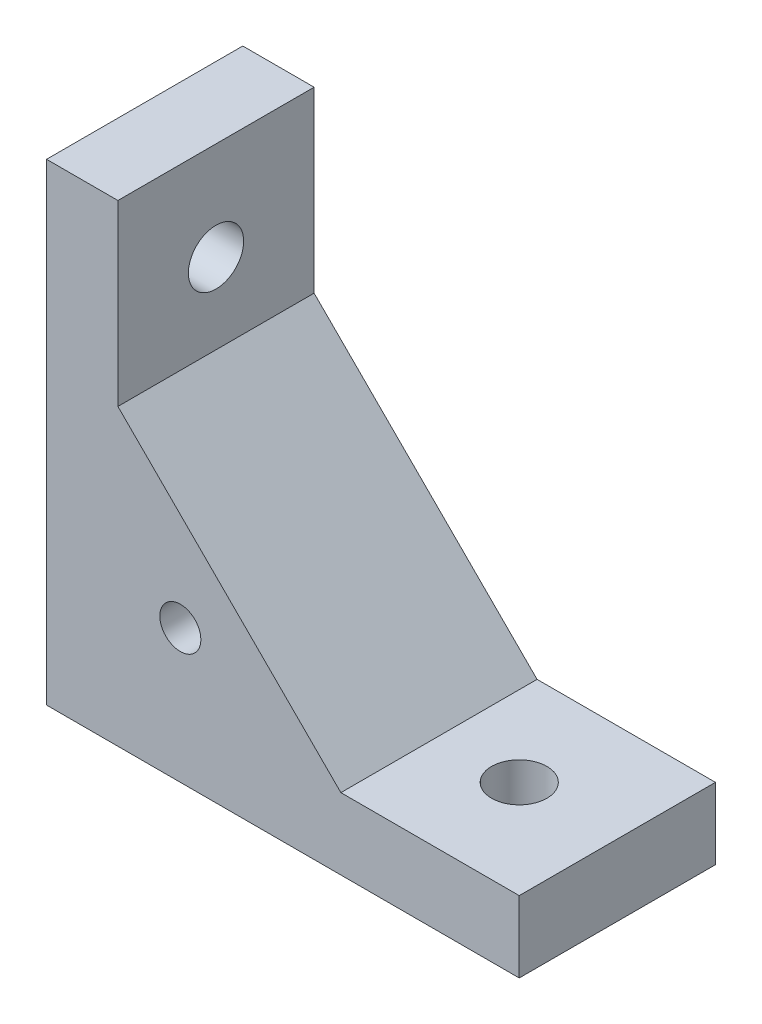
ISO-10303-21;
HEADER;
FILE_DESCRIPTION(('STEP AP214'),'2;1');
FILE_NAME('part.step','',(''),(''),'','','');
FILE_SCHEMA(('AUTOMOTIVE_DESIGN { 1 0 10303 214 1 1 1 1 }'));
ENDSEC;
DATA;
#1=APPLICATION_CONTEXT('core data for automotive mechanical design processes');
#2=APPLICATION_PROTOCOL_DEFINITION('international standard','automotive_design',2000,#1);
#3=PRODUCT_CONTEXT('',#1,'mechanical');
#4=PRODUCT('Part','Part','',(#3));
#5=PRODUCT_RELATED_PRODUCT_CATEGORY('part','',(#4));
#6=PRODUCT_DEFINITION_FORMATION('','',#4);
#7=PRODUCT_DEFINITION_CONTEXT('part definition',#1,'design');
#8=PRODUCT_DEFINITION('design','',#6,#7);
#9=PRODUCT_DEFINITION_SHAPE('','',#8);
#10=(LENGTH_UNIT() NAMED_UNIT(*) SI_UNIT(.MILLI.,.METRE.));
#11=(NAMED_UNIT(*) PLANE_ANGLE_UNIT() SI_UNIT($,.RADIAN.));
#12=(NAMED_UNIT(*) SI_UNIT($,.STERADIAN.) SOLID_ANGLE_UNIT());
#13=UNCERTAINTY_MEASURE_WITH_UNIT(LENGTH_MEASURE(1.E-05),#10,'distance_accuracy_value','');
#14=(GEOMETRIC_REPRESENTATION_CONTEXT(3) GLOBAL_UNCERTAINTY_ASSIGNED_CONTEXT((#13)) GLOBAL_UNIT_ASSIGNED_CONTEXT((#10,
#11,#12)) REPRESENTATION_CONTEXT('',''));
#15=CARTESIAN_POINT('',(0.,0.,0.));
#16=DIRECTION('',(0.,0.,1.));
#17=DIRECTION('',(1.,0.,0.));
#18=AXIS2_PLACEMENT_3D('',#15,#16,#17);
#19=CARTESIAN_POINT('',(0.,0.,11.));
#20=DIRECTION('',(0.,0.,-1.));
#21=DIRECTION('',(-1.,0.,0.));
#22=AXIS2_PLACEMENT_3D('',#19,#20,#21);
#23=PLANE('',#22);
#24=DIRECTION('',(1.,0.,0.));
#25=VECTOR('',#24,1.);
#26=CARTESIAN_POINT('',(53.,0.,11.));
#27=LINE('',#26,#25);
#28=CARTESIAN_POINT('',(0.,0.,11.));
#29=VERTEX_POINT('',#28);
#30=CARTESIAN_POINT('',(53.,0.,11.));
#31=VERTEX_POINT('',#30);
#32=EDGE_CURVE('E155',#29,#31,#27,.T.);
#33=ORIENTED_EDGE('',*,*,#32,.T.);
#34=DIRECTION('',(0.,1.,0.));
#35=VECTOR('',#34,1.);
#36=CARTESIAN_POINT('',(53.,8.,11.));
#37=LINE('',#36,#35);
#38=CARTESIAN_POINT('',(53.,8.,11.));
#39=VERTEX_POINT('',#38);
#40=EDGE_CURVE('E97',#31,#39,#37,.T.);
#41=ORIENTED_EDGE('',*,*,#40,.T.);
#42=DIRECTION('',(-1.,0.,0.));
#43=VECTOR('',#42,1.);
#44=CARTESIAN_POINT('',(33.,8.,11.));
#45=LINE('',#44,#43);
#46=CARTESIAN_POINT('',(33.,8.,11.));
#47=VERTEX_POINT('',#46);
#48=EDGE_CURVE('E172',#39,#47,#45,.T.);
#49=ORIENTED_EDGE('',*,*,#48,.T.);
#50=DIRECTION('',(-0.707106781186547,0.707106781186548,0.));
#51=VECTOR('',#50,1.);
#52=CARTESIAN_POINT('',(8.,33.,11.));
#53=LINE('',#52,#51);
#54=CARTESIAN_POINT('',(8.,33.,11.));
#55=VERTEX_POINT('',#54);
#56=EDGE_CURVE('E113',#47,#55,#53,.T.);
#57=ORIENTED_EDGE('',*,*,#56,.T.);
#58=DIRECTION('',(0.,1.,0.));
#59=VECTOR('',#58,1.);
#60=CARTESIAN_POINT('',(8.,53.,11.));
#61=LINE('',#60,#59);
#62=CARTESIAN_POINT('',(8.,53.,11.));
#63=VERTEX_POINT('',#62);
#64=EDGE_CURVE('E107',#55,#63,#61,.T.);
#65=ORIENTED_EDGE('',*,*,#64,.T.);
#66=DIRECTION('',(-1.,0.,0.));
#67=VECTOR('',#66,1.);
#68=CARTESIAN_POINT('',(0.,53.,11.));
#69=LINE('',#68,#67);
#70=CARTESIAN_POINT('',(0.,53.,11.));
#71=VERTEX_POINT('',#70);
#72=EDGE_CURVE('E111',#63,#71,#69,.T.);
#73=ORIENTED_EDGE('',*,*,#72,.T.);
#74=DIRECTION('',(0.,-1.,0.));
#75=VECTOR('',#74,1.);
#76=CARTESIAN_POINT('',(0.,0.,11.));
#77=LINE('',#76,#75);
#78=EDGE_CURVE('E57',#71,#29,#77,.T.);
#79=ORIENTED_EDGE('',*,*,#78,.T.);
#80=EDGE_LOOP('',(#33,#41,#49,#57,#65,#73,#79));
#81=FACE_BOUND('',#80,.T.);
#82=CARTESIAN_POINT('',(15.,15.,11.));
#83=DIRECTION('',(0.,0.,1.));
#84=DIRECTION('',(1.,0.,0.));
#85=AXIS2_PLACEMENT_3D('',#82,#83,#84);
#86=CIRCLE('',#85,2.3);
#87=CARTESIAN_POINT('',(17.3,15.,11.));
#88=VERTEX_POINT('',#87);
#89=EDGE_CURVE('E140',#88,#88,#86,.T.);
#90=ORIENTED_EDGE('',*,*,#89,.F.);
#91=EDGE_LOOP('',(#90));
#92=FACE_BOUND('',#91,.T.);
#93=ADVANCED_FACE('F39',(#81,#92),#23,.F.);
#94=CARTESIAN_POINT('',(0.,0.,-11.));
#95=DIRECTION('',(0.,0.,-1.));
#96=DIRECTION('',(-1.,0.,0.));
#97=AXIS2_PLACEMENT_3D('',#94,#95,#96);
#98=PLANE('',#97);
#99=DIRECTION('',(1.,0.,0.));
#100=VECTOR('',#99,1.);
#101=CARTESIAN_POINT('',(53.,0.,-11.));
#102=LINE('',#101,#100);
#103=CARTESIAN_POINT('',(0.,0.,-11.));
#104=VERTEX_POINT('',#103);
#105=CARTESIAN_POINT('',(53.,0.,-11.));
#106=VERTEX_POINT('',#105);
#107=EDGE_CURVE('E135',#104,#106,#102,.T.);
#108=ORIENTED_EDGE('',*,*,#107,.F.);
#109=DIRECTION('',(0.,-1.,0.));
#110=VECTOR('',#109,1.);
#111=CARTESIAN_POINT('',(0.,0.,-11.));
#112=LINE('',#111,#110);
#113=CARTESIAN_POINT('',(0.,53.,-11.));
#114=VERTEX_POINT('',#113);
#115=EDGE_CURVE('E89',#114,#104,#112,.T.);
#116=ORIENTED_EDGE('',*,*,#115,.F.);
#117=DIRECTION('',(-1.,0.,0.));
#118=VECTOR('',#117,1.);
#119=CARTESIAN_POINT('',(0.,53.,-11.));
#120=LINE('',#119,#118);
#121=CARTESIAN_POINT('',(8.,53.,-11.));
#122=VERTEX_POINT('',#121);
#123=EDGE_CURVE('E83',#122,#114,#120,.T.);
#124=ORIENTED_EDGE('',*,*,#123,.F.);
#125=DIRECTION('',(0.,1.,0.));
#126=VECTOR('',#125,1.);
#127=CARTESIAN_POINT('',(8.,53.,-11.));
#128=LINE('',#127,#126);
#129=CARTESIAN_POINT('',(8.,33.,-11.));
#130=VERTEX_POINT('',#129);
#131=EDGE_CURVE('E122',#130,#122,#128,.T.);
#132=ORIENTED_EDGE('',*,*,#131,.F.);
#133=DIRECTION('',(-0.707106781186547,0.707106781186548,0.));
#134=VECTOR('',#133,1.);
#135=CARTESIAN_POINT('',(8.,33.,-11.));
#136=LINE('',#135,#134);
#137=CARTESIAN_POINT('',(33.,8.,-11.));
#138=VERTEX_POINT('',#137);
#139=EDGE_CURVE('E146',#138,#130,#136,.T.);
#140=ORIENTED_EDGE('',*,*,#139,.F.);
#141=DIRECTION('',(-1.,0.,0.));
#142=VECTOR('',#141,1.);
#143=CARTESIAN_POINT('',(33.,8.,-11.));
#144=LINE('',#143,#142);
#145=CARTESIAN_POINT('',(53.,8.,-11.));
#146=VERTEX_POINT('',#145);
#147=EDGE_CURVE('E143',#146,#138,#144,.T.);
#148=ORIENTED_EDGE('',*,*,#147,.F.);
#149=DIRECTION('',(0.,1.,0.));
#150=VECTOR('',#149,1.);
#151=CARTESIAN_POINT('',(53.,8.,-11.));
#152=LINE('',#151,#150);
#153=EDGE_CURVE('E139',#106,#146,#152,.T.);
#154=ORIENTED_EDGE('',*,*,#153,.F.);
#155=EDGE_LOOP('',(#108,#116,#124,#132,#140,#148,#154));
#156=FACE_BOUND('',#155,.T.);
#157=CARTESIAN_POINT('',(15.,15.,-11.));
#158=DIRECTION('',(0.,0.,1.));
#159=DIRECTION('',(1.,0.,0.));
#160=AXIS2_PLACEMENT_3D('',#157,#158,#159);
#161=CIRCLE('',#160,2.3);
#162=CARTESIAN_POINT('',(17.3,15.,-11.));
#163=VERTEX_POINT('',#162);
#164=EDGE_CURVE('E188',#163,#163,#161,.T.);
#165=ORIENTED_EDGE('',*,*,#164,.T.);
#166=EDGE_LOOP('',(#165));
#167=FACE_BOUND('',#166,.T.);
#168=ADVANCED_FACE('F176',(#156,#167),#98,.T.);
#169=CARTESIAN_POINT('',(53.,0.,11.));
#170=DIRECTION('',(0.,1.,0.));
#171=DIRECTION('',(-1.,0.,0.));
#172=AXIS2_PLACEMENT_3D('',#169,#170,#171);
#173=PLANE('',#172);
#174=CARTESIAN_POINT('',(42.,0.,0.));
#175=DIRECTION('',(0.,1.,0.));
#176=DIRECTION('',(0.,0.,1.));
#177=AXIS2_PLACEMENT_3D('',#174,#175,#176);
#178=CIRCLE('',#177,3.1);
#179=CARTESIAN_POINT('',(42.,0.,3.1));
#180=VERTEX_POINT('',#179);
#181=EDGE_CURVE('E192',#180,#180,#178,.T.);
#182=ORIENTED_EDGE('',*,*,#181,.T.);
#183=EDGE_LOOP('',(#182));
#184=FACE_BOUND('',#183,.T.);
#185=ORIENTED_EDGE('',*,*,#107,.T.);
#186=DIRECTION('',(0.,0.,-1.));
#187=VECTOR('',#186,1.);
#188=CARTESIAN_POINT('',(53.,0.,11.));
#189=LINE('',#188,#187);
#190=EDGE_CURVE('E11',#31,#106,#189,.T.);
#191=ORIENTED_EDGE('',*,*,#190,.F.);
#192=ORIENTED_EDGE('',*,*,#32,.F.);
#193=DIRECTION('',(0.,0.,-1.));
#194=VECTOR('',#193,1.);
#195=CARTESIAN_POINT('',(0.,0.,11.));
#196=LINE('',#195,#194);
#197=EDGE_CURVE('E131',#29,#104,#196,.T.);
#198=ORIENTED_EDGE('',*,*,#197,.T.);
#199=EDGE_LOOP('',(#185,#191,#192,#198));
#200=FACE_BOUND('',#199,.T.);
#201=ADVANCED_FACE('F41',(#184,#200),#173,.F.);
#202=CARTESIAN_POINT('',(53.,8.,11.));
#203=DIRECTION('',(-1.,0.,0.));
#204=DIRECTION('',(0.,0.,1.));
#205=AXIS2_PLACEMENT_3D('',#202,#203,#204);
#206=PLANE('',#205);
#207=ORIENTED_EDGE('',*,*,#153,.T.);
#208=DIRECTION('',(0.,0.,-1.));
#209=VECTOR('',#208,1.);
#210=CARTESIAN_POINT('',(53.,8.,11.));
#211=LINE('',#210,#209);
#212=EDGE_CURVE('E49',#39,#146,#211,.T.);
#213=ORIENTED_EDGE('',*,*,#212,.F.);
#214=ORIENTED_EDGE('',*,*,#40,.F.);
#215=ORIENTED_EDGE('',*,*,#190,.T.);
#216=EDGE_LOOP('',(#207,#213,#214,#215));
#217=FACE_BOUND('',#216,.T.);
#218=ADVANCED_FACE('F255',(#217),#206,.F.);
#219=CARTESIAN_POINT('',(33.,8.,11.));
#220=DIRECTION('',(0.,-1.,0.));
#221=DIRECTION('',(0.,0.,-1.));
#222=AXIS2_PLACEMENT_3D('',#219,#220,#221);
#223=PLANE('',#222);
#224=CARTESIAN_POINT('',(42.,8.,0.));
#225=DIRECTION('',(0.,1.,0.));
#226=DIRECTION('',(0.,0.,1.));
#227=AXIS2_PLACEMENT_3D('',#224,#225,#226);
#228=CIRCLE('',#227,3.1);
#229=CARTESIAN_POINT('',(42.,8.,3.1));
#230=VERTEX_POINT('',#229);
#231=EDGE_CURVE('E199',#230,#230,#228,.T.);
#232=ORIENTED_EDGE('',*,*,#231,.F.);
#233=EDGE_LOOP('',(#232));
#234=FACE_BOUND('',#233,.T.);
#235=ORIENTED_EDGE('',*,*,#147,.T.);
#236=DIRECTION('',(0.,0.,-1.));
#237=VECTOR('',#236,1.);
#238=CARTESIAN_POINT('',(33.,8.,11.));
#239=LINE('',#238,#237);
#240=EDGE_CURVE('E162',#47,#138,#239,.T.);
#241=ORIENTED_EDGE('',*,*,#240,.F.);
#242=ORIENTED_EDGE('',*,*,#48,.F.);
#243=ORIENTED_EDGE('',*,*,#212,.T.);
#244=EDGE_LOOP('',(#235,#241,#242,#243));
#245=FACE_BOUND('',#244,.T.);
#246=ADVANCED_FACE('F170',(#234,#245),#223,.F.);
#247=CARTESIAN_POINT('',(8.,33.,11.));
#248=DIRECTION('',(-0.707106781186548,-0.707106781186547,0.));
#249=DIRECTION('',(0.707106781186547,-0.707106781186548,0.));
#250=AXIS2_PLACEMENT_3D('',#247,#248,#249);
#251=PLANE('',#250);
#252=ORIENTED_EDGE('',*,*,#139,.T.);
#253=DIRECTION('',(0.,0.,-1.));
#254=VECTOR('',#253,1.);
#255=CARTESIAN_POINT('',(8.,33.,11.));
#256=LINE('',#255,#254);
#257=EDGE_CURVE('E124',#55,#130,#256,.T.);
#258=ORIENTED_EDGE('',*,*,#257,.F.);
#259=ORIENTED_EDGE('',*,*,#56,.F.);
#260=ORIENTED_EDGE('',*,*,#240,.T.);
#261=EDGE_LOOP('',(#252,#258,#259,#260));
#262=FACE_BOUND('',#261,.T.);
#263=ADVANCED_FACE('F179',(#262),#251,.F.);
#264=CARTESIAN_POINT('',(8.,53.,11.));
#265=DIRECTION('',(-1.,0.,0.));
#266=DIRECTION('',(0.,-1.,0.));
#267=AXIS2_PLACEMENT_3D('',#264,#265,#266);
#268=PLANE('',#267);
#269=CARTESIAN_POINT('',(8.,42.,0.));
#270=DIRECTION('',(1.,0.,0.));
#271=DIRECTION('',(0.,0.,-1.));
#272=AXIS2_PLACEMENT_3D('',#269,#270,#271);
#273=CIRCLE('',#272,3.09999999999999);
#274=CARTESIAN_POINT('',(8.,42.,-3.09999999999999));
#275=VERTEX_POINT('',#274);
#276=EDGE_CURVE('E207',#275,#275,#273,.T.);
#277=ORIENTED_EDGE('',*,*,#276,.F.);
#278=EDGE_LOOP('',(#277));
#279=FACE_BOUND('',#278,.T.);
#280=ORIENTED_EDGE('',*,*,#131,.T.);
#281=DIRECTION('',(0.,0.,-1.));
#282=VECTOR('',#281,1.);
#283=CARTESIAN_POINT('',(8.,53.,11.));
#284=LINE('',#283,#282);
#285=EDGE_CURVE('E119',#63,#122,#284,.T.);
#286=ORIENTED_EDGE('',*,*,#285,.F.);
#287=ORIENTED_EDGE('',*,*,#64,.F.);
#288=ORIENTED_EDGE('',*,*,#257,.T.);
#289=EDGE_LOOP('',(#280,#286,#287,#288));
#290=FACE_BOUND('',#289,.T.);
#291=ADVANCED_FACE('F120',(#279,#290),#268,.F.);
#292=CARTESIAN_POINT('',(0.,53.,11.));
#293=DIRECTION('',(0.,-1.,0.));
#294=DIRECTION('',(0.,0.,-1.));
#295=AXIS2_PLACEMENT_3D('',#292,#293,#294);
#296=PLANE('',#295);
#297=ORIENTED_EDGE('',*,*,#123,.T.);
#298=DIRECTION('',(0.,0.,-1.));
#299=VECTOR('',#298,1.);
#300=CARTESIAN_POINT('',(0.,53.,11.));
#301=LINE('',#300,#299);
#302=EDGE_CURVE('E125',#71,#114,#301,.T.);
#303=ORIENTED_EDGE('',*,*,#302,.F.);
#304=ORIENTED_EDGE('',*,*,#72,.F.);
#305=ORIENTED_EDGE('',*,*,#285,.T.);
#306=EDGE_LOOP('',(#297,#303,#304,#305));
#307=FACE_BOUND('',#306,.T.);
#308=ADVANCED_FACE('F127',(#307),#296,.F.);
#309=CARTESIAN_POINT('',(0.,0.,11.));
#310=DIRECTION('',(1.,0.,0.));
#311=DIRECTION('',(0.,0.,-1.));
#312=AXIS2_PLACEMENT_3D('',#309,#310,#311);
#313=PLANE('',#312);
#314=CARTESIAN_POINT('',(0.,42.,0.));
#315=DIRECTION('',(1.,0.,0.));
#316=DIRECTION('',(0.,0.,-1.));
#317=AXIS2_PLACEMENT_3D('',#314,#315,#316);
#318=CIRCLE('',#317,3.1);
#319=CARTESIAN_POINT('',(0.,42.,-3.1));
#320=VERTEX_POINT('',#319);
#321=EDGE_CURVE('E203',#320,#320,#318,.T.);
#322=ORIENTED_EDGE('',*,*,#321,.T.);
#323=EDGE_LOOP('',(#322));
#324=FACE_BOUND('',#323,.T.);
#325=ORIENTED_EDGE('',*,*,#115,.T.);
#326=ORIENTED_EDGE('',*,*,#197,.F.);
#327=ORIENTED_EDGE('',*,*,#78,.F.);
#328=ORIENTED_EDGE('',*,*,#302,.T.);
#329=EDGE_LOOP('',(#325,#326,#327,#328));
#330=FACE_BOUND('',#329,.T.);
#331=ADVANCED_FACE('F220',(#324,#330),#313,.F.);
#332=CARTESIAN_POINT('',(15.,15.,11.));
#333=DIRECTION('',(0.,0.,-1.));
#334=DIRECTION('',(-1.,0.,0.));
#335=AXIS2_PLACEMENT_3D('',#332,#333,#334);
#336=CYLINDRICAL_SURFACE('',#335,2.3);
#337=ORIENTED_EDGE('',*,*,#89,.T.);
#338=EDGE_LOOP('',(#337));
#339=FACE_BOUND('',#338,.T.);
#340=ORIENTED_EDGE('',*,*,#164,.F.);
#341=EDGE_LOOP('',(#340));
#342=FACE_BOUND('',#341,.T.);
#343=ADVANCED_FACE('F230',(#339,#342),#336,.F.);
#344=CARTESIAN_POINT('',(42.,8.,0.));
#345=DIRECTION('',(0.,1.,0.));
#346=DIRECTION('',(0.,0.,1.));
#347=AXIS2_PLACEMENT_3D('',#344,#345,#346);
#348=CYLINDRICAL_SURFACE('',#347,3.1);
#349=ORIENTED_EDGE('',*,*,#181,.F.);
#350=EDGE_LOOP('',(#349));
#351=FACE_BOUND('',#350,.T.);
#352=ORIENTED_EDGE('',*,*,#231,.T.);
#353=EDGE_LOOP('',(#352));
#354=FACE_BOUND('',#353,.T.);
#355=ADVANCED_FACE('F238',(#351,#354),#348,.F.);
#356=CARTESIAN_POINT('',(8.,42.,0.));
#357=DIRECTION('',(1.,0.,0.));
#358=DIRECTION('',(0.,0.,-1.));
#359=AXIS2_PLACEMENT_3D('',#356,#357,#358);
#360=CYLINDRICAL_SURFACE('',#359,3.1);
#361=ORIENTED_EDGE('',*,*,#321,.F.);
#362=EDGE_LOOP('',(#361));
#363=FACE_BOUND('',#362,.T.);
#364=ORIENTED_EDGE('',*,*,#276,.T.);
#365=EDGE_LOOP('',(#364));
#366=FACE_BOUND('',#365,.T.);
#367=ADVANCED_FACE('F212',(#363,#366),#360,.F.);
#368=CLOSED_SHELL('',(#93,#168,#201,#218,#246,#263,#291,#308,#331,#343,#355,#367));
#369=MANIFOLD_SOLID_BREP('B2',#368);
#370=ADVANCED_BREP_SHAPE_REPRESENTATION('',(#18,#369),#14);
#371=SHAPE_DEFINITION_REPRESENTATION(#9,#370);
ENDSEC;
END-ISO-10303-21;
